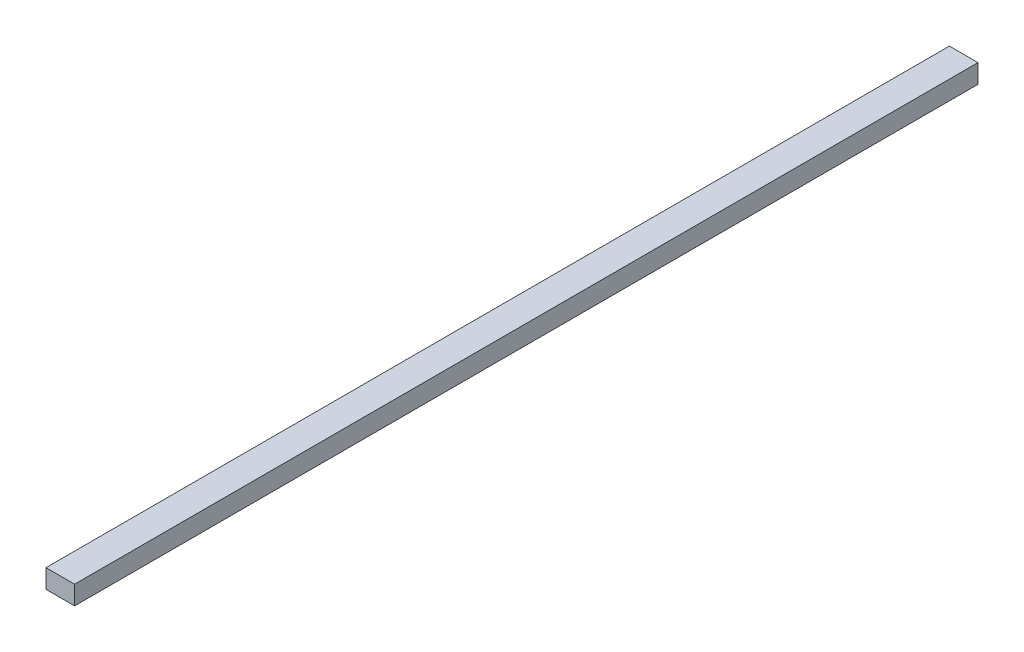
ISO-10303-21;
HEADER;
FILE_DESCRIPTION(('STEP AP214'),'2;1');
FILE_NAME('part.step','',(''),(''),'','','');
FILE_SCHEMA(('AUTOMOTIVE_DESIGN { 1 0 10303 214 1 1 1 1 }'));
ENDSEC;
DATA;
#1=APPLICATION_CONTEXT('core data for automotive mechanical design processes');
#2=APPLICATION_PROTOCOL_DEFINITION('international standard','automotive_design',2000,#1);
#3=PRODUCT_CONTEXT('',#1,'mechanical');
#4=PRODUCT('Part','Part','',(#3));
#5=PRODUCT_RELATED_PRODUCT_CATEGORY('part','',(#4));
#6=PRODUCT_DEFINITION_FORMATION('','',#4);
#7=PRODUCT_DEFINITION_CONTEXT('part definition',#1,'design');
#8=PRODUCT_DEFINITION('design','',#6,#7);
#9=PRODUCT_DEFINITION_SHAPE('','',#8);
#10=(LENGTH_UNIT() NAMED_UNIT(*) SI_UNIT(.MILLI.,.METRE.));
#11=(NAMED_UNIT(*) PLANE_ANGLE_UNIT() SI_UNIT($,.RADIAN.));
#12=(NAMED_UNIT(*) SI_UNIT($,.STERADIAN.) SOLID_ANGLE_UNIT());
#13=UNCERTAINTY_MEASURE_WITH_UNIT(LENGTH_MEASURE(1.E-05),#10,'distance_accuracy_value','');
#14=(GEOMETRIC_REPRESENTATION_CONTEXT(3) GLOBAL_UNCERTAINTY_ASSIGNED_CONTEXT((#13)) GLOBAL_UNIT_ASSIGNED_CONTEXT((#10,
#11,#12)) REPRESENTATION_CONTEXT('',''));
#15=CARTESIAN_POINT('',(0.,0.,0.));
#16=DIRECTION('',(0.,0.,1.));
#17=DIRECTION('',(1.,0.,0.));
#18=AXIS2_PLACEMENT_3D('',#15,#16,#17);
#19=CARTESIAN_POINT('',(-4.826,-3.175,304.8));
#20=DIRECTION('',(1.,0.,0.));
#21=DIRECTION('',(0.,0.,-1.));
#22=AXIS2_PLACEMENT_3D('',#19,#20,#21);
#23=PLANE('',#22);
#24=DIRECTION('',(0.,-1.,0.));
#25=VECTOR('',#24,1.);
#26=CARTESIAN_POINT('',(-4.826,-3.175,0.));
#27=LINE('',#26,#25);
#28=CARTESIAN_POINT('',(-4.826,3.175,0.));
#29=VERTEX_POINT('',#28);
#30=CARTESIAN_POINT('',(-4.826,-3.175,0.));
#31=VERTEX_POINT('',#30);
#32=EDGE_CURVE('E109',#29,#31,#27,.T.);
#33=ORIENTED_EDGE('',*,*,#32,.T.);
#34=DIRECTION('',(0.,0.,-1.));
#35=VECTOR('',#34,1.);
#36=CARTESIAN_POINT('',(-4.826,-3.175,304.8));
#37=LINE('',#36,#35);
#38=CARTESIAN_POINT('',(-4.826,-3.175,304.8));
#39=VERTEX_POINT('',#38);
#40=EDGE_CURVE('E12',#39,#31,#37,.T.);
#41=ORIENTED_EDGE('',*,*,#40,.F.);
#42=DIRECTION('',(0.,-1.,0.));
#43=VECTOR('',#42,1.);
#44=CARTESIAN_POINT('',(-4.826,-3.175,304.8));
#45=LINE('',#44,#43);
#46=CARTESIAN_POINT('',(-4.826,3.175,304.8));
#47=VERTEX_POINT('',#46);
#48=EDGE_CURVE('E92',#47,#39,#45,.T.);
#49=ORIENTED_EDGE('',*,*,#48,.F.);
#50=DIRECTION('',(0.,0.,-1.));
#51=VECTOR('',#50,1.);
#52=CARTESIAN_POINT('',(-4.826,3.175,304.8));
#53=LINE('',#52,#51);
#54=EDGE_CURVE('E104',#47,#29,#53,.T.);
#55=ORIENTED_EDGE('',*,*,#54,.T.);
#56=EDGE_LOOP('',(#33,#41,#49,#55));
#57=FACE_BOUND('',#56,.T.);
#58=ADVANCED_FACE('F40',(#57),#23,.F.);
#59=CARTESIAN_POINT('',(4.826,-3.175,304.8));
#60=DIRECTION('',(0.,1.,0.));
#61=DIRECTION('',(-1.,0.,0.));
#62=AXIS2_PLACEMENT_3D('',#59,#60,#61);
#63=PLANE('',#62);
#64=DIRECTION('',(1.,0.,0.));
#65=VECTOR('',#64,1.);
#66=CARTESIAN_POINT('',(4.826,-3.175,0.));
#67=LINE('',#66,#65);
#68=CARTESIAN_POINT('',(4.826,-3.175,0.));
#69=VERTEX_POINT('',#68);
#70=EDGE_CURVE('E97',#31,#69,#67,.T.);
#71=ORIENTED_EDGE('',*,*,#70,.T.);
#72=DIRECTION('',(0.,0.,-1.));
#73=VECTOR('',#72,1.);
#74=CARTESIAN_POINT('',(4.826,-3.175,304.8));
#75=LINE('',#74,#73);
#76=CARTESIAN_POINT('',(4.826,-3.175,304.8));
#77=VERTEX_POINT('',#76);
#78=EDGE_CURVE('E49',#77,#69,#75,.T.);
#79=ORIENTED_EDGE('',*,*,#78,.F.);
#80=DIRECTION('',(1.,0.,0.));
#81=VECTOR('',#80,1.);
#82=CARTESIAN_POINT('',(4.826,-3.175,304.8));
#83=LINE('',#82,#81);
#84=EDGE_CURVE('E87',#39,#77,#83,.T.);
#85=ORIENTED_EDGE('',*,*,#84,.F.);
#86=ORIENTED_EDGE('',*,*,#40,.T.);
#87=EDGE_LOOP('',(#71,#79,#85,#86));
#88=FACE_BOUND('',#87,.T.);
#89=ADVANCED_FACE('F96',(#88),#63,.F.);
#90=CARTESIAN_POINT('',(4.826,-3.175,304.8));
#91=DIRECTION('',(-1.,0.,0.));
#92=DIRECTION('',(0.,0.,1.));
#93=AXIS2_PLACEMENT_3D('',#90,#91,#92);
#94=PLANE('',#93);
#95=DIRECTION('',(0.,1.,0.));
#96=VECTOR('',#95,1.);
#97=CARTESIAN_POINT('',(4.826,-3.175,0.));
#98=LINE('',#97,#96);
#99=CARTESIAN_POINT('',(4.826,3.175,0.));
#100=VERTEX_POINT('',#99);
#101=EDGE_CURVE('E74',#69,#100,#98,.T.);
#102=ORIENTED_EDGE('',*,*,#101,.T.);
#103=DIRECTION('',(0.,0.,-1.));
#104=VECTOR('',#103,1.);
#105=CARTESIAN_POINT('',(4.826,3.175,304.8));
#106=LINE('',#105,#104);
#107=CARTESIAN_POINT('',(4.826,3.175,304.8));
#108=VERTEX_POINT('',#107);
#109=EDGE_CURVE('E99',#108,#100,#106,.T.);
#110=ORIENTED_EDGE('',*,*,#109,.F.);
#111=DIRECTION('',(0.,1.,0.));
#112=VECTOR('',#111,1.);
#113=CARTESIAN_POINT('',(4.826,-3.175,304.8));
#114=LINE('',#113,#112);
#115=EDGE_CURVE('E90',#77,#108,#114,.T.);
#116=ORIENTED_EDGE('',*,*,#115,.F.);
#117=ORIENTED_EDGE('',*,*,#78,.T.);
#118=EDGE_LOOP('',(#102,#110,#116,#117));
#119=FACE_BOUND('',#118,.T.);
#120=ADVANCED_FACE('F100',(#119),#94,.F.);
#121=CARTESIAN_POINT('',(4.826,3.175,304.8));
#122=DIRECTION('',(0.,-1.,0.));
#123=DIRECTION('',(1.,0.,0.));
#124=AXIS2_PLACEMENT_3D('',#121,#122,#123);
#125=PLANE('',#124);
#126=DIRECTION('',(-1.,0.,0.));
#127=VECTOR('',#126,1.);
#128=CARTESIAN_POINT('',(4.826,3.175,0.));
#129=LINE('',#128,#127);
#130=EDGE_CURVE('E80',#100,#29,#129,.T.);
#131=ORIENTED_EDGE('',*,*,#130,.T.);
#132=ORIENTED_EDGE('',*,*,#54,.F.);
#133=DIRECTION('',(-1.,0.,0.));
#134=VECTOR('',#133,1.);
#135=CARTESIAN_POINT('',(4.826,3.175,304.8));
#136=LINE('',#135,#134);
#137=EDGE_CURVE('E57',#108,#47,#136,.T.);
#138=ORIENTED_EDGE('',*,*,#137,.F.);
#139=ORIENTED_EDGE('',*,*,#109,.T.);
#140=EDGE_LOOP('',(#131,#132,#138,#139));
#141=FACE_BOUND('',#140,.T.);
#142=ADVANCED_FACE('F121',(#141),#125,.F.);
#143=CARTESIAN_POINT('',(0.,0.,304.8));
#144=DIRECTION('',(0.,0.,1.));
#145=DIRECTION('',(1.,0.,0.));
#146=AXIS2_PLACEMENT_3D('',#143,#144,#145);
#147=PLANE('',#146);
#148=ORIENTED_EDGE('',*,*,#48,.T.);
#149=ORIENTED_EDGE('',*,*,#84,.T.);
#150=ORIENTED_EDGE('',*,*,#115,.T.);
#151=ORIENTED_EDGE('',*,*,#137,.T.);
#152=EDGE_LOOP('',(#148,#149,#150,#151));
#153=FACE_BOUND('',#152,.T.);
#154=ADVANCED_FACE('F88',(#153),#147,.T.);
#155=CARTESIAN_POINT('',(0.,0.,0.));
#156=DIRECTION('',(0.,0.,1.));
#157=DIRECTION('',(1.,0.,0.));
#158=AXIS2_PLACEMENT_3D('',#155,#156,#157);
#159=PLANE('',#158);
#160=ORIENTED_EDGE('',*,*,#32,.F.);
#161=ORIENTED_EDGE('',*,*,#130,.F.);
#162=ORIENTED_EDGE('',*,*,#101,.F.);
#163=ORIENTED_EDGE('',*,*,#70,.F.);
#164=EDGE_LOOP('',(#160,#161,#162,#163));
#165=FACE_BOUND('',#164,.T.);
#166=ADVANCED_FACE('F124',(#165),#159,.F.);
#167=CLOSED_SHELL('',(#58,#89,#120,#142,#154,#166));
#168=MANIFOLD_SOLID_BREP('B2',#167);
#169=ADVANCED_BREP_SHAPE_REPRESENTATION('',(#18,#168),#14);
#170=SHAPE_DEFINITION_REPRESENTATION(#9,#169);
ENDSEC;
END-ISO-10303-21;
